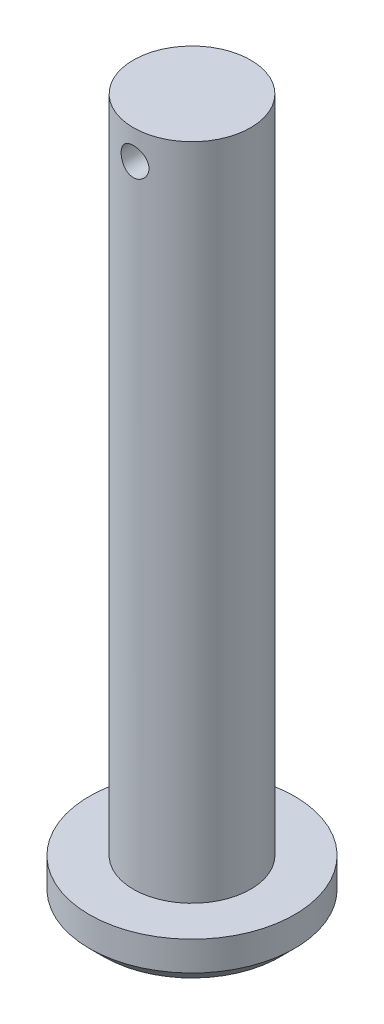
ISO-10303-21;
HEADER;
FILE_DESCRIPTION(('STEP AP214'),'2;1');
FILE_NAME('part.step','',(''),(''),'','','');
FILE_SCHEMA(('AUTOMOTIVE_DESIGN { 1 0 10303 214 1 1 1 1 }'));
ENDSEC;
DATA;
#1=APPLICATION_CONTEXT('core data for automotive mechanical design processes');
#2=APPLICATION_PROTOCOL_DEFINITION('international standard','automotive_design',2000,#1);
#3=PRODUCT_CONTEXT('',#1,'mechanical');
#4=PRODUCT('Part','Part','',(#3));
#5=PRODUCT_RELATED_PRODUCT_CATEGORY('part','',(#4));
#6=PRODUCT_DEFINITION_FORMATION('','',#4);
#7=PRODUCT_DEFINITION_CONTEXT('part definition',#1,'design');
#8=PRODUCT_DEFINITION('design','',#6,#7);
#9=PRODUCT_DEFINITION_SHAPE('','',#8);
#10=(LENGTH_UNIT() NAMED_UNIT(*) SI_UNIT(.MILLI.,.METRE.));
#11=(NAMED_UNIT(*) PLANE_ANGLE_UNIT() SI_UNIT($,.RADIAN.));
#12=(NAMED_UNIT(*) SI_UNIT($,.STERADIAN.) SOLID_ANGLE_UNIT());
#13=UNCERTAINTY_MEASURE_WITH_UNIT(LENGTH_MEASURE(1.E-05),#10,'distance_accuracy_value','');
#14=(GEOMETRIC_REPRESENTATION_CONTEXT(3) GLOBAL_UNCERTAINTY_ASSIGNED_CONTEXT((#13)) GLOBAL_UNIT_ASSIGNED_CONTEXT((#10,
#11,#12)) REPRESENTATION_CONTEXT('',''));
#15=CARTESIAN_POINT('',(0.,0.,0.));
#16=DIRECTION('',(0.,0.,1.));
#17=DIRECTION('',(1.,0.,0.));
#18=AXIS2_PLACEMENT_3D('',#15,#16,#17);
#19=CARTESIAN_POINT('',(0.,-3.,0.));
#20=DIRECTION('',(0.,1.,0.));
#21=DIRECTION('',(0.,0.,1.));
#22=AXIS2_PLACEMENT_3D('',#19,#20,#21);
#23=CYLINDRICAL_SURFACE('',#22,7.);
#24=CARTESIAN_POINT('',(0.,-2.,0.));
#25=DIRECTION('',(0.,1.,0.));
#26=DIRECTION('',(0.,0.,1.));
#27=AXIS2_PLACEMENT_3D('',#24,#25,#26);
#28=CIRCLE('',#27,7.);
#29=CARTESIAN_POINT('',(0.,-2.,7.));
#30=VERTEX_POINT('',#29);
#31=EDGE_CURVE('E41',#30,#30,#28,.T.);
#32=ORIENTED_EDGE('',*,*,#31,.T.);
#33=EDGE_LOOP('',(#32));
#34=FACE_BOUND('',#33,.T.);
#35=CARTESIAN_POINT('',(0.,0.,0.));
#36=DIRECTION('',(0.,1.,0.));
#37=DIRECTION('',(0.,0.,1.));
#38=AXIS2_PLACEMENT_3D('',#35,#36,#37);
#39=CIRCLE('',#38,7.);
#40=CARTESIAN_POINT('',(0.,0.,7.));
#41=VERTEX_POINT('',#40);
#42=EDGE_CURVE('E49',#41,#41,#39,.T.);
#43=ORIENTED_EDGE('',*,*,#42,.F.);
#44=EDGE_LOOP('',(#43));
#45=FACE_BOUND('',#44,.T.);
#46=ADVANCED_FACE('F33',(#34,#45),#23,.T.);
#47=CARTESIAN_POINT('',(0.,-3.,0.));
#48=DIRECTION('',(0.,1.,0.));
#49=DIRECTION('',(0.,0.,1.));
#50=AXIS2_PLACEMENT_3D('',#47,#48,#49);
#51=PLANE('',#50);
#52=CARTESIAN_POINT('',(0.,-3.,0.));
#53=DIRECTION('',(0.,1.,0.));
#54=DIRECTION('',(0.,0.,1.));
#55=AXIS2_PLACEMENT_3D('',#52,#53,#54);
#56=CIRCLE('',#55,5.99999999999999);
#57=CARTESIAN_POINT('',(0.,-3.,5.99999999999999));
#58=VERTEX_POINT('',#57);
#59=EDGE_CURVE('E10',#58,#58,#56,.F.);
#60=ORIENTED_EDGE('',*,*,#59,.T.);
#61=EDGE_LOOP('',(#60));
#62=FACE_BOUND('',#61,.T.);
#63=ADVANCED_FACE('F86',(#62),#51,.F.);
#64=CARTESIAN_POINT('',(0.,0.,0.));
#65=DIRECTION('',(0.,1.,0.));
#66=DIRECTION('',(0.,0.,1.));
#67=AXIS2_PLACEMENT_3D('',#64,#65,#66);
#68=PLANE('',#67);
#69=CARTESIAN_POINT('',(0.,0.,0.));
#70=DIRECTION('',(0.,1.,0.));
#71=DIRECTION('',(0.,0.,1.));
#72=AXIS2_PLACEMENT_3D('',#69,#70,#71);
#73=CIRCLE('',#72,4.);
#74=CARTESIAN_POINT('',(0.,0.,4.));
#75=VERTEX_POINT('',#74);
#76=EDGE_CURVE('E45',#75,#75,#73,.T.);
#77=ORIENTED_EDGE('',*,*,#76,.F.);
#78=EDGE_LOOP('',(#77));
#79=FACE_BOUND('',#78,.T.);
#80=ORIENTED_EDGE('',*,*,#42,.T.);
#81=EDGE_LOOP('',(#80));
#82=FACE_BOUND('',#81,.T.);
#83=ADVANCED_FACE('F84',(#79,#82),#68,.T.);
#84=CARTESIAN_POINT('',(0.,45.,0.));
#85=DIRECTION('',(0.,-1.,0.));
#86=DIRECTION('',(0.,0.,-1.));
#87=AXIS2_PLACEMENT_3D('',#84,#85,#86);
#88=CYLINDRICAL_SURFACE('',#87,4.);
#89=CARTESIAN_POINT('',(0.95,43.,-3.88555015409658));
#90=CARTESIAN_POINT('',(0.949998366385795,42.9474519607544,-3.88555119658447));
#91=CARTESIAN_POINT('',(0.945625214347678,42.8948852272456,-3.88662777084838));
#92=CARTESIAN_POINT('',(0.928272377596758,42.7912552200879,-3.89080804298714));
#93=CARTESIAN_POINT('',(0.915287184591519,42.7401929305322,-3.89391303822829));
#94=CARTESIAN_POINT('',(0.881149268434963,42.6410857472817,-3.90177911038668));
#95=CARTESIAN_POINT('',(0.860006428752925,42.5930372837412,-3.90653818260282));
#96=CARTESIAN_POINT('',(0.810182790178991,42.5011658444391,-3.91717372245091));
#97=CARTESIAN_POINT('',(0.781501865442132,42.4573429392379,-3.92305020873714));
#98=CARTESIAN_POINT('',(0.716807680169345,42.3742952291203,-3.93538912387704));
#99=CARTESIAN_POINT('',(0.680672374015558,42.3351667582561,-3.94186015741135));
#100=CARTESIAN_POINT('',(0.602358310692676,42.2634652450526,-3.9545841222894));
#101=CARTESIAN_POINT('',(0.560179030101745,42.2308927710656,-3.96083703468498));
#102=CARTESIAN_POINT('',(0.470320149807633,42.1728391235413,-3.97251482162618));
#103=CARTESIAN_POINT('',(0.422578335238791,42.1474517721039,-3.97792835730083));
#104=CARTESIAN_POINT('',(0.323355281554751,42.1050977880806,-3.98721966649302));
#105=CARTESIAN_POINT('',(0.271874539966059,42.0881300374714,-3.99109764390069));
#106=CARTESIAN_POINT('',(0.167638263268302,42.0634031703038,-3.99682007391831));
#107=CARTESIAN_POINT('',(0.114923496016076,42.0554806783965,-3.9987005602098));
#108=CARTESIAN_POINT('',(0.00888180404808134,42.0485572312954,-4.00034139793232));
#109=CARTESIAN_POINT('',(-0.0444450376939672,42.0495550807853,-4.00010203342113));
#110=CARTESIAN_POINT('',(-0.149066874564699,42.0603247533266,-3.99755726020232));
#111=CARTESIAN_POINT('',(-0.200381171649827,42.0699203364648,-3.99529335320897));
#112=CARTESIAN_POINT('',(-0.300649456938187,42.0973308238776,-3.98900175091233));
#113=CARTESIAN_POINT('',(-0.349603326627055,42.1151461403819,-3.98497396714895));
#114=CARTESIAN_POINT('',(-0.444235754849386,42.1586384308444,-3.97554232938614));
#115=CARTESIAN_POINT('',(-0.489883551839127,42.1843798066072,-3.97012726618428));
#116=CARTESIAN_POINT('',(-0.576274415240521,42.2429450236499,-3.9585111535359));
#117=CARTESIAN_POINT('',(-0.61701670220965,42.2757699881424,-3.95230997950376));
#118=CARTESIAN_POINT('',(-0.693490090116474,42.3485216287455,-3.93962089598158));
#119=CARTESIAN_POINT('',(-0.72907414881546,42.3886024466731,-3.93312968327407));
#120=CARTESIAN_POINT('',(-0.793046400952024,42.4742304451245,-3.92073236244736));
#121=CARTESIAN_POINT('',(-0.821434321790248,42.5197778326329,-3.9148262764987));
#122=CARTESIAN_POINT('',(-0.870290427474959,42.6153132627876,-3.90425726360328));
#123=CARTESIAN_POINT('',(-0.890726398768535,42.6653183795197,-3.89959941652524));
#124=CARTESIAN_POINT('',(-0.922857992618089,42.7681909711268,-3.89212129602027));
#125=CARTESIAN_POINT('',(-0.934555281006105,42.8210578984006,-3.88930067238144));
#126=CARTESIAN_POINT('',(-0.948640150073781,42.9267980509447,-3.88588903434823));
#127=CARTESIAN_POINT('',(-0.951243768155168,42.9796408647193,-3.8852462915152));
#128=CARTESIAN_POINT('',(-0.947656130744841,43.0850056667362,-3.88612290482417));
#129=CARTESIAN_POINT('',(-0.941465598063381,43.1375276809893,-3.8876420832732));
#130=CARTESIAN_POINT('',(-0.920654019411597,43.2399787198995,-3.89262209093516));
#131=CARTESIAN_POINT('',(-0.906155910822367,43.2899342245111,-3.89605458670746));
#132=CARTESIAN_POINT('',(-0.869275695627036,43.3867064563439,-3.90444812874248));
#133=CARTESIAN_POINT('',(-0.846892726996901,43.4335228397094,-3.90940934212708));
#134=CARTESIAN_POINT('',(-0.794416189355448,43.5236113722592,-3.92041218658714));
#135=CARTESIAN_POINT('',(-0.764191829227679,43.5668051222027,-3.92647156008142));
#136=CARTESIAN_POINT('',(-0.697058205673845,43.6475870449842,-3.93894313562688));
#137=CARTESIAN_POINT('',(-0.660147955508432,43.6851743889039,-3.94535538966067));
#138=CARTESIAN_POINT('',(-0.579704501599115,43.7545364261926,-3.95798355973407));
#139=CARTESIAN_POINT('',(-0.536041793133143,43.7861625527976,-3.96419189239773));
#140=CARTESIAN_POINT('',(-0.443898901350508,43.8416323468607,-3.9755635343327));
#141=CARTESIAN_POINT('',(-0.395418961162978,43.8654764068254,-3.98072689630454));
#142=CARTESIAN_POINT('',(-0.295342502269511,43.9045091159305,-3.98939535866095));
#143=CARTESIAN_POINT('',(-0.243770296420002,43.9197574503956,-3.99291186453037));
#144=CARTESIAN_POINT('',(-0.138701882707194,43.9413484124132,-3.99794009464609));
#145=CARTESIAN_POINT('',(-0.0852060093947551,43.947692580907,-3.99945216577429));
#146=CARTESIAN_POINT('',(0.0207896064205038,43.9512155843269,-4.0002885918271));
#147=CARTESIAN_POINT('',(0.0732817299154622,43.9486146886967,-3.99966552523578));
#148=CARTESIAN_POINT('',(0.177058003591494,43.9348210064717,-3.99641664154496));
#149=CARTESIAN_POINT('',(0.228342183460653,43.9236284312653,-3.99379087371966));
#150=CARTESIAN_POINT('',(0.328041015431031,43.8930822731527,-3.98683803404943));
#151=CARTESIAN_POINT('',(0.376467354169047,43.8737649984513,-3.98251853700102));
#152=CARTESIAN_POINT('',(0.469418177614434,43.8275514528033,-3.97263562042283));
#153=CARTESIAN_POINT('',(0.513942213796518,43.8006543121312,-3.96707205816221));
#154=CARTESIAN_POINT('',(0.598881797617392,43.7393534837571,-3.95515134706186));
#155=CARTESIAN_POINT('',(0.639185750890859,43.7047980268894,-3.94877946304627));
#156=CARTESIAN_POINT('',(0.713497872024467,43.6294609496697,-3.93603169626298));
#157=CARTESIAN_POINT('',(0.747504478179233,43.5886777894468,-3.92965581289578));
#158=CARTESIAN_POINT('',(0.808800126119139,43.5012381405262,-3.91750394866502));
#159=CARTESIAN_POINT('',(0.835969891162668,43.4544963201296,-3.91173951716314));
#160=CARTESIAN_POINT('',(0.882024967652497,43.3569799093764,-3.90161403146148));
#161=CARTESIAN_POINT('',(0.90091672283727,43.3062084922186,-3.89725188640608));
#162=CARTESIAN_POINT('',(0.926831562053165,43.2128867518078,-3.89115917080241));
#163=CARTESIAN_POINT('',(0.935501763545242,43.1708095197432,-3.8890708196325));
#164=CARTESIAN_POINT('',(0.947086452900724,43.0858256441271,-3.88626593244295));
#165=CARTESIAN_POINT('',(0.95000133426828,43.0429190574831,-3.88554930263574));
#166=CARTESIAN_POINT('',(0.95,43.,-3.88555015409658));
#167=B_SPLINE_CURVE_WITH_KNOTS('',3,(#89,#90,#91,#92,#93,#94,#95,#96,#97,#98,#99,#100,#101,#102,
#103,#104,#105,#106,#107,#108,#109,#110,#111,#112,#113,#114,#115,#116,#117,#118,#119,#120,#121,
#122,#123,#124,#125,#126,#127,#128,#129,#130,#131,#132,#133,#134,#135,#136,#137,#138,#139,#140,
#141,#142,#143,#144,#145,#146,#147,#148,#149,#150,#151,#152,#153,#154,#155,#156,#157,#158,#159,
#160,#161,#162,#163,#164,#165,#166),.UNSPECIFIED.,.T.,.F.,(4,2,2,2,2,2,2,2,2,2,2,2,2,2,2,2,2,2,
2,2,2,2,2,2,2,2,2,2,2,2,2,2,2,2,2,2,2,2,4),(0.,0.157486642863022,0.315074112017903,
0.472471251182707,0.629871018189388,0.790087903096126,0.950318671542176,1.11255417690157,
1.2747681335394,1.43400337941495,1.59321728825759,1.74924039239735,1.90527132213904,
2.06260509144077,2.21996382680071,2.38117364286885,2.54238956486874,2.70425194156266,
2.8660834549805,3.02404318201929,3.18198992675794,3.33765757241444,3.49334224195186,
3.65181238492351,3.81030593484878,3.97233924111705,4.13436437359816,4.29525015428154,
4.45610808888229,4.61303359925174,4.76995524877091,4.92618296476412,5.08242861387174,
5.24210285634096,5.4018166442159,5.56414896886739,5.72635470592196,5.85499205495925,
5.98362060846773),.UNSPECIFIED.);
#168=CARTESIAN_POINT('',(0.95,43.,-3.88555015409658));
#169=VERTEX_POINT('',#168);
#170=EDGE_CURVE('E57',#169,#169,#167,.T.);
#171=ORIENTED_EDGE('',*,*,#170,.F.);
#172=EDGE_LOOP('',(#171));
#173=FACE_BOUND('',#172,.T.);
#174=CARTESIAN_POINT('',(0.95,43.,3.88555015409659));
#175=CARTESIAN_POINT('',(0.949998366385795,43.0525480392456,3.88555119658448));
#176=CARTESIAN_POINT('',(0.945625214347678,43.1051147727544,3.88662777084838));
#177=CARTESIAN_POINT('',(0.928272377596758,43.2087447799121,3.89080804298714));
#178=CARTESIAN_POINT('',(0.915287184591519,43.2598070694678,3.89391303822829));
#179=CARTESIAN_POINT('',(0.881149268434963,43.3589142527183,3.90177911038668));
#180=CARTESIAN_POINT('',(0.860006428752925,43.4069627162588,3.90653818260282));
#181=CARTESIAN_POINT('',(0.810182790178991,43.4988341555609,3.91717372245091));
#182=CARTESIAN_POINT('',(0.781501865442132,43.5426570607621,3.92305020873714));
#183=CARTESIAN_POINT('',(0.716807680169345,43.6257047708797,3.93538912387704));
#184=CARTESIAN_POINT('',(0.680672374015558,43.6648332417439,3.94186015741135));
#185=CARTESIAN_POINT('',(0.602358310692676,43.7365347549474,3.9545841222894));
#186=CARTESIAN_POINT('',(0.560179030101745,43.7691072289344,3.96083703468498));
#187=CARTESIAN_POINT('',(0.470320149807633,43.8271608764587,3.97251482162618));
#188=CARTESIAN_POINT('',(0.422578335238791,43.8525482278961,3.97792835730083));
#189=CARTESIAN_POINT('',(0.323355281554751,43.8949022119194,3.98721966649302));
#190=CARTESIAN_POINT('',(0.271874539966059,43.9118699625286,3.99109764390069));
#191=CARTESIAN_POINT('',(0.167638263268302,43.9365968296962,3.99682007391831));
#192=CARTESIAN_POINT('',(0.114923496016076,43.9445193216035,3.9987005602098));
#193=CARTESIAN_POINT('',(0.00888180404808102,43.9514427687046,4.00034139793232));
#194=CARTESIAN_POINT('',(-0.0444450376939675,43.9504449192147,4.00010203342113));
#195=CARTESIAN_POINT('',(-0.1490668745647,43.9396752466734,3.99755726020232));
#196=CARTESIAN_POINT('',(-0.200381171649827,43.9300796635352,3.99529335320897));
#197=CARTESIAN_POINT('',(-0.300649456938187,43.9026691761224,3.98900175091233));
#198=CARTESIAN_POINT('',(-0.349603326627055,43.8848538596181,3.98497396714895));
#199=CARTESIAN_POINT('',(-0.444235754849386,43.8413615691556,3.97554232938614));
#200=CARTESIAN_POINT('',(-0.489883551839127,43.8156201933928,3.97012726618428));
#201=CARTESIAN_POINT('',(-0.576274415240522,43.7570549763501,3.9585111535359));
#202=CARTESIAN_POINT('',(-0.61701670220965,43.7242300118576,3.95230997950376));
#203=CARTESIAN_POINT('',(-0.693490090116473,43.6514783712545,3.93962089598158));
#204=CARTESIAN_POINT('',(-0.729074148815457,43.6113975533269,3.93312968327407));
#205=CARTESIAN_POINT('',(-0.793046400952021,43.5257695548755,3.92073236244736));
#206=CARTESIAN_POINT('',(-0.821434321790247,43.4802221673671,3.9148262764987));
#207=CARTESIAN_POINT('',(-0.870290427474961,43.3846867372124,3.90425726360328));
#208=CARTESIAN_POINT('',(-0.890726398768537,43.3346816204803,3.89959941652524));
#209=CARTESIAN_POINT('',(-0.92285799261809,43.2318090288732,3.89212129602027));
#210=CARTESIAN_POINT('',(-0.934555281006105,43.1789421015994,3.88930067238144));
#211=CARTESIAN_POINT('',(-0.948640150073782,43.0732019490553,3.88588903434823));
#212=CARTESIAN_POINT('',(-0.951243768155169,43.0203591352807,3.8852462915152));
#213=CARTESIAN_POINT('',(-0.94765613074484,42.9149943332638,3.88612290482417));
#214=CARTESIAN_POINT('',(-0.94146559806338,42.8624723190107,3.8876420832732));
#215=CARTESIAN_POINT('',(-0.920654019411596,42.7600212801005,3.89262209093516));
#216=CARTESIAN_POINT('',(-0.906155910822365,42.7100657754888,3.89605458670746));
#217=CARTESIAN_POINT('',(-0.869275695627034,42.6132935436561,3.90444812874248));
#218=CARTESIAN_POINT('',(-0.846892726996901,42.5664771602905,3.90940934212708));
#219=CARTESIAN_POINT('',(-0.794416189355449,42.4763886277408,3.92041218658714));
#220=CARTESIAN_POINT('',(-0.764191829227681,42.4331948777973,3.92647156008142));
#221=CARTESIAN_POINT('',(-0.697058205673847,42.3524129550158,3.93894313562688));
#222=CARTESIAN_POINT('',(-0.660147955508434,42.3148256110961,3.94535538966067));
#223=CARTESIAN_POINT('',(-0.579704501599116,42.2454635738074,3.95798355973407));
#224=CARTESIAN_POINT('',(-0.536041793133143,42.2138374472024,3.96419189239773));
#225=CARTESIAN_POINT('',(-0.443898901350507,42.1583676531393,3.9755635343327));
#226=CARTESIAN_POINT('',(-0.395418961162978,42.1345235931746,3.98072689630454));
#227=CARTESIAN_POINT('',(-0.295342502269511,42.0954908840695,3.98939535866095));
#228=CARTESIAN_POINT('',(-0.243770296420002,42.0802425496044,3.99291186453037));
#229=CARTESIAN_POINT('',(-0.138701882707194,42.0586515875868,3.99794009464609));
#230=CARTESIAN_POINT('',(-0.0852060093947542,42.052307419093,3.99945216577429));
#231=CARTESIAN_POINT('',(0.0207896064205039,42.0487844156731,4.0002885918271));
#232=CARTESIAN_POINT('',(0.0732817299154613,42.0513853113033,3.99966552523578));
#233=CARTESIAN_POINT('',(0.177058003591493,42.0651789935283,3.99641664154496));
#234=CARTESIAN_POINT('',(0.228342183460653,42.0763715687347,3.99379087371966));
#235=CARTESIAN_POINT('',(0.328041015431031,42.1069177268473,3.98683803404943));
#236=CARTESIAN_POINT('',(0.376467354169048,42.1262350015487,3.98251853700102));
#237=CARTESIAN_POINT('',(0.469418177614434,42.1724485471967,3.97263562042283));
#238=CARTESIAN_POINT('',(0.513942213796518,42.1993456878688,3.96707205816221));
#239=CARTESIAN_POINT('',(0.598881797617392,42.2606465162428,3.95515134706186));
#240=CARTESIAN_POINT('',(0.639185750890859,42.2952019731106,3.94877946304627));
#241=CARTESIAN_POINT('',(0.713497872024467,42.3705390503303,3.93603169626298));
#242=CARTESIAN_POINT('',(0.747504478179233,42.4113222105532,3.92965581289578));
#243=CARTESIAN_POINT('',(0.808800126119139,42.4987618594738,3.91750394866502));
#244=CARTESIAN_POINT('',(0.835969891162668,42.5455036798704,3.91173951716314));
#245=CARTESIAN_POINT('',(0.882024967652497,42.6430200906236,3.90161403146148));
#246=CARTESIAN_POINT('',(0.90091672283727,42.6937915077814,3.89725188640608));
#247=CARTESIAN_POINT('',(0.926831562053165,42.7871132481922,3.89115917080241));
#248=CARTESIAN_POINT('',(0.935501763545241,42.8291904802568,3.8890708196325));
#249=CARTESIAN_POINT('',(0.947086452900723,42.9141743558729,3.88626593244295));
#250=CARTESIAN_POINT('',(0.95000133426828,42.9570809425169,3.88554930263575));
#251=CARTESIAN_POINT('',(0.95,43.,3.88555015409659));
#252=B_SPLINE_CURVE_WITH_KNOTS('',3,(#174,#175,#176,#177,#178,#179,#180,#181,#182,#183,#184,
#185,#186,#187,#188,#189,#190,#191,#192,#193,#194,#195,#196,#197,#198,#199,#200,#201,#202,#203,
#204,#205,#206,#207,#208,#209,#210,#211,#212,#213,#214,#215,#216,#217,#218,#219,#220,#221,#222,
#223,#224,#225,#226,#227,#228,#229,#230,#231,#232,#233,#234,#235,#236,#237,#238,#239,#240,#241,
#242,#243,#244,#245,#246,#247,#248,#249,#250,#251),.UNSPECIFIED.,.T.,.F.,(4,2,2,2,2,2,2,2,2,2,2,
2,2,2,2,2,2,2,2,2,2,2,2,2,2,2,2,2,2,2,2,2,2,2,2,2,2,2,4),(0.,0.157486642863022,
0.315074112017903,0.472471251182707,0.629871018189388,0.790087903096126,0.950318671542176,
1.11255417690157,1.2747681335394,1.43400337941495,1.59321728825759,1.74924039239735,
1.90527132213904,2.06260509144077,2.21996382680071,2.38117364286885,2.54238956486874,
2.70425194156267,2.86608345498049,3.02404318201931,3.18198992675795,3.33765757241444,
3.49334224195186,3.6518123849235,3.81030593484878,3.97233924111705,4.13436437359815,
4.29525015428154,4.45610808888229,4.61303359925174,4.76995524877091,4.92618296476411,
5.08242861387174,5.24210285634096,5.4018166442159,5.56414896886739,5.72635470592196,
5.85499205495925,5.98362060846773),.UNSPECIFIED.);
#253=CARTESIAN_POINT('',(0.95,43.,3.88555015409659));
#254=VERTEX_POINT('',#253);
#255=EDGE_CURVE('E65',#254,#254,#252,.T.);
#256=ORIENTED_EDGE('',*,*,#255,.F.);
#257=EDGE_LOOP('',(#256));
#258=FACE_BOUND('',#257,.T.);
#259=CARTESIAN_POINT('',(0.,45.,0.));
#260=DIRECTION('',(0.,1.,0.));
#261=DIRECTION('',(0.,0.,1.));
#262=AXIS2_PLACEMENT_3D('',#259,#260,#261);
#263=CIRCLE('',#262,4.);
#264=CARTESIAN_POINT('',(0.,45.,4.));
#265=VERTEX_POINT('',#264);
#266=EDGE_CURVE('E53',#265,#265,#263,.T.);
#267=ORIENTED_EDGE('',*,*,#266,.F.);
#268=EDGE_LOOP('',(#267));
#269=FACE_BOUND('',#268,.T.);
#270=ORIENTED_EDGE('',*,*,#76,.T.);
#271=EDGE_LOOP('',(#270));
#272=FACE_BOUND('',#271,.T.);
#273=ADVANCED_FACE('F80',(#173,#258,#269,#272),#88,.T.);
#274=CARTESIAN_POINT('',(0.,45.,0.));
#275=DIRECTION('',(0.,1.,0.));
#276=DIRECTION('',(0.,0.,1.));
#277=AXIS2_PLACEMENT_3D('',#274,#275,#276);
#278=PLANE('',#277);
#279=ORIENTED_EDGE('',*,*,#266,.T.);
#280=EDGE_LOOP('',(#279));
#281=FACE_BOUND('',#280,.T.);
#282=ADVANCED_FACE('F76',(#281),#278,.T.);
#283=CARTESIAN_POINT('',(0.,-2.,0.));
#284=DIRECTION('',(0.,1.,0.));
#285=DIRECTION('',(0.,0.,1.));
#286=AXIS2_PLACEMENT_3D('',#283,#284,#285);
#287=CONICAL_SURFACE('',#286,7.,0.785398163397452);
#288=ORIENTED_EDGE('',*,*,#59,.F.);
#289=EDGE_LOOP('',(#288));
#290=FACE_BOUND('',#289,.T.);
#291=ORIENTED_EDGE('',*,*,#31,.F.);
#292=EDGE_LOOP('',(#291));
#293=FACE_BOUND('',#292,.T.);
#294=ADVANCED_FACE('F36',(#290,#293),#287,.T.);
#295=CARTESIAN_POINT('',(0.,43.,-7.001));
#296=DIRECTION('',(0.,0.,1.));
#297=DIRECTION('',(1.,0.,0.));
#298=AXIS2_PLACEMENT_3D('',#295,#296,#297);
#299=CYLINDRICAL_SURFACE('',#298,0.95);
#300=ORIENTED_EDGE('',*,*,#255,.T.);
#301=EDGE_LOOP('',(#300));
#302=FACE_BOUND('',#301,.T.);
#303=ORIENTED_EDGE('',*,*,#170,.T.);
#304=EDGE_LOOP('',(#303));
#305=FACE_BOUND('',#304,.T.);
#306=ADVANCED_FACE('F69',(#302,#305),#299,.F.);
#307=CLOSED_SHELL('',(#46,#63,#83,#273,#282,#294,#306));
#308=MANIFOLD_SOLID_BREP('B2',#307);
#309=ADVANCED_BREP_SHAPE_REPRESENTATION('',(#18,#308),#14);
#310=SHAPE_DEFINITION_REPRESENTATION(#9,#309);
ENDSEC;
END-ISO-10303-21;
